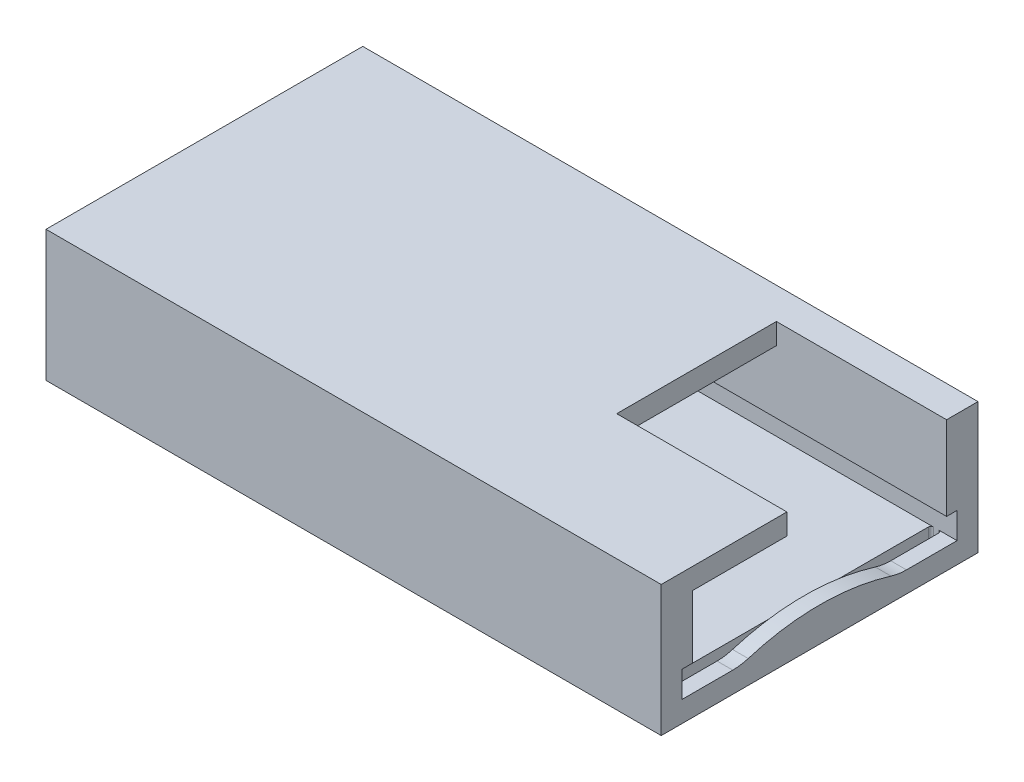
ISO-10303-21;
HEADER;
FILE_DESCRIPTION(('STEP AP214'),'2;1');
FILE_NAME('part.step','',(''),(''),'','','');
FILE_SCHEMA(('AUTOMOTIVE_DESIGN { 1 0 10303 214 1 1 1 1 }'));
ENDSEC;
DATA;
#1=APPLICATION_CONTEXT('core data for automotive mechanical design processes');
#2=APPLICATION_PROTOCOL_DEFINITION('international standard','automotive_design',2000,#1);
#3=PRODUCT_CONTEXT('',#1,'mechanical');
#4=PRODUCT('Part','Part','',(#3));
#5=PRODUCT_RELATED_PRODUCT_CATEGORY('part','',(#4));
#6=PRODUCT_DEFINITION_FORMATION('','',#4);
#7=PRODUCT_DEFINITION_CONTEXT('part definition',#1,'design');
#8=PRODUCT_DEFINITION('design','',#6,#7);
#9=PRODUCT_DEFINITION_SHAPE('','',#8);
#10=(LENGTH_UNIT() NAMED_UNIT(*) SI_UNIT(.MILLI.,.METRE.));
#11=(NAMED_UNIT(*) PLANE_ANGLE_UNIT() SI_UNIT($,.RADIAN.));
#12=(NAMED_UNIT(*) SI_UNIT($,.STERADIAN.) SOLID_ANGLE_UNIT());
#13=UNCERTAINTY_MEASURE_WITH_UNIT(LENGTH_MEASURE(1.E-05),#10,'distance_accuracy_value','');
#14=(GEOMETRIC_REPRESENTATION_CONTEXT(3) GLOBAL_UNCERTAINTY_ASSIGNED_CONTEXT((#13)) GLOBAL_UNIT_ASSIGNED_CONTEXT((#10,
#11,#12)) REPRESENTATION_CONTEXT('',''));
#15=CARTESIAN_POINT('',(0.,0.,0.));
#16=DIRECTION('',(0.,0.,1.));
#17=DIRECTION('',(1.,0.,0.));
#18=AXIS2_PLACEMENT_3D('',#15,#16,#17);
#19=CARTESIAN_POINT('',(22.5,10.,12.1));
#20=DIRECTION('',(-1.,0.,0.));
#21=DIRECTION('',(0.,0.,1.));
#22=AXIS2_PLACEMENT_3D('',#19,#20,#21);
#23=PLANE('',#22);
#24=DIRECTION('',(0.,0.,-1.));
#25=VECTOR('',#24,1.);
#26=CARTESIAN_POINT('',(22.5,1.6,-10.5));
#27=LINE('',#26,#25);
#28=CARTESIAN_POINT('',(22.5,1.6,10.3));
#29=VERTEX_POINT('',#28);
#30=CARTESIAN_POINT('',(22.5,1.6,-10.3));
#31=VERTEX_POINT('',#30);
#32=EDGE_CURVE('E336',#29,#31,#27,.T.);
#33=ORIENTED_EDGE('',*,*,#32,.F.);
#34=DIRECTION('',(0.,-1.,0.));
#35=VECTOR('',#34,1.);
#36=CARTESIAN_POINT('',(22.5,0.,10.3));
#37=LINE('',#36,#35);
#38=CARTESIAN_POINT('',(22.5,0.,10.3));
#39=VERTEX_POINT('',#38);
#40=EDGE_CURVE('E448',#29,#39,#37,.T.);
#41=ORIENTED_EDGE('',*,*,#40,.T.);
#42=DIRECTION('',(0.,0.,-1.));
#43=VECTOR('',#42,1.);
#44=CARTESIAN_POINT('',(22.5,0.,12.1));
#45=LINE('',#44,#43);
#46=CARTESIAN_POINT('',(22.5,0.,-10.3));
#47=VERTEX_POINT('',#46);
#48=EDGE_CURVE('E401',#39,#47,#45,.T.);
#49=ORIENTED_EDGE('',*,*,#48,.T.);
#50=DIRECTION('',(0.,-1.,0.));
#51=VECTOR('',#50,1.);
#52=CARTESIAN_POINT('',(22.5,1.6,-10.3));
#53=LINE('',#52,#51);
#54=EDGE_CURVE('E446',#47,#31,#53,.F.);
#55=ORIENTED_EDGE('',*,*,#54,.T.);
#56=EDGE_LOOP('',(#33,#41,#49,#55));
#57=FACE_BOUND('',#56,.T.);
#58=ADVANCED_FACE('F37',(#57),#23,.F.);
#59=CARTESIAN_POINT('',(-22.5,10.,12.1));
#60=DIRECTION('',(1.,0.,0.));
#61=DIRECTION('',(0.,0.,-1.));
#62=AXIS2_PLACEMENT_3D('',#59,#60,#61);
#63=PLANE('',#62);
#64=DIRECTION('',(0.,0.,1.));
#65=VECTOR('',#64,1.);
#66=CARTESIAN_POINT('',(-22.5,8.4,2.5));
#67=LINE('',#66,#65);
#68=CARTESIAN_POINT('',(-22.5,8.4,-7.));
#69=VERTEX_POINT('',#68);
#70=CARTESIAN_POINT('',(-22.5,8.4,2.5));
#71=VERTEX_POINT('',#70);
#72=EDGE_CURVE('E330',#69,#71,#67,.T.);
#73=ORIENTED_EDGE('',*,*,#72,.T.);
#74=DIRECTION('',(0.,-1.,0.));
#75=VECTOR('',#74,1.);
#76=CARTESIAN_POINT('',(-22.5,3.6,2.5));
#77=LINE('',#76,#75);
#78=CARTESIAN_POINT('',(-22.5,3.6,2.5));
#79=VERTEX_POINT('',#78);
#80=EDGE_CURVE('E318',#71,#79,#77,.T.);
#81=ORIENTED_EDGE('',*,*,#80,.T.);
#82=DIRECTION('',(0.,0.,-1.));
#83=VECTOR('',#82,1.);
#84=CARTESIAN_POINT('',(-22.5,3.6,2.5));
#85=LINE('',#84,#83);
#86=CARTESIAN_POINT('',(-22.5,3.6,-7.));
#87=VERTEX_POINT('',#86);
#88=EDGE_CURVE('E324',#79,#87,#85,.T.);
#89=ORIENTED_EDGE('',*,*,#88,.T.);
#90=DIRECTION('',(0.,1.,0.));
#91=VECTOR('',#90,1.);
#92=CARTESIAN_POINT('',(-22.5,3.6,-7.));
#93=LINE('',#92,#91);
#94=EDGE_CURVE('E327',#87,#69,#93,.T.);
#95=ORIENTED_EDGE('',*,*,#94,.T.);
#96=EDGE_LOOP('',(#73,#81,#89,#95));
#97=FACE_BOUND('',#96,.T.);
#98=DIRECTION('',(0.,0.,1.));
#99=VECTOR('',#98,1.);
#100=CARTESIAN_POINT('',(-22.5,0.,12.1));
#101=LINE('',#100,#99);
#102=CARTESIAN_POINT('',(-22.5,0.,-12.1));
#103=VERTEX_POINT('',#102);
#104=CARTESIAN_POINT('',(-22.5,0.,12.1));
#105=VERTEX_POINT('',#104);
#106=EDGE_CURVE('E374',#103,#105,#101,.T.);
#107=ORIENTED_EDGE('',*,*,#106,.T.);
#108=DIRECTION('',(0.,-1.,0.));
#109=VECTOR('',#108,1.);
#110=CARTESIAN_POINT('',(-22.5,10.,12.1));
#111=LINE('',#110,#109);
#112=CARTESIAN_POINT('',(-22.5,10.,12.1));
#113=VERTEX_POINT('',#112);
#114=EDGE_CURVE('E407',#113,#105,#111,.T.);
#115=ORIENTED_EDGE('',*,*,#114,.F.);
#116=DIRECTION('',(0.,0.,1.));
#117=VECTOR('',#116,1.);
#118=CARTESIAN_POINT('',(-22.5,10.,12.1));
#119=LINE('',#118,#117);
#120=CARTESIAN_POINT('',(-22.5,10.,-12.1));
#121=VERTEX_POINT('',#120);
#122=EDGE_CURVE('E388',#121,#113,#119,.T.);
#123=ORIENTED_EDGE('',*,*,#122,.F.);
#124=DIRECTION('',(0.,-1.,0.));
#125=VECTOR('',#124,1.);
#126=CARTESIAN_POINT('',(-22.5,10.,-12.1));
#127=LINE('',#126,#125);
#128=EDGE_CURVE('E396',#121,#103,#127,.T.);
#129=ORIENTED_EDGE('',*,*,#128,.T.);
#130=EDGE_LOOP('',(#107,#115,#123,#129));
#131=FACE_BOUND('',#130,.T.);
#132=ADVANCED_FACE('F584',(#97,#131),#63,.F.);
#133=CARTESIAN_POINT('',(22.5,10.,12.1));
#134=DIRECTION('',(0.,0.,-1.));
#135=DIRECTION('',(-1.,0.,0.));
#136=AXIS2_PLACEMENT_3D('',#133,#134,#135);
#137=PLANE('',#136);
#138=DIRECTION('',(1.,0.,0.));
#139=VECTOR('',#138,1.);
#140=CARTESIAN_POINT('',(22.5,0.,12.1));
#141=LINE('',#140,#139);
#142=CARTESIAN_POINT('',(24.5,0.,12.1));
#143=VERTEX_POINT('',#142);
#144=EDGE_CURVE('E399',#105,#143,#141,.T.);
#145=ORIENTED_EDGE('',*,*,#144,.T.);
#146=DIRECTION('',(0.,-1.,0.));
#147=VECTOR('',#146,1.);
#148=CARTESIAN_POINT('',(24.5,0.,12.1));
#149=LINE('',#148,#147);
#150=CARTESIAN_POINT('',(24.5,10.,12.1));
#151=VERTEX_POINT('',#150);
#152=EDGE_CURVE('E297',#151,#143,#149,.T.);
#153=ORIENTED_EDGE('',*,*,#152,.F.);
#154=DIRECTION('',(1.,0.,0.));
#155=VECTOR('',#154,1.);
#156=CARTESIAN_POINT('',(22.5,10.,12.1));
#157=LINE('',#156,#155);
#158=EDGE_CURVE('E391',#113,#151,#157,.T.);
#159=ORIENTED_EDGE('',*,*,#158,.F.);
#160=ORIENTED_EDGE('',*,*,#114,.T.);
#161=EDGE_LOOP('',(#145,#153,#159,#160));
#162=FACE_BOUND('',#161,.T.);
#163=ADVANCED_FACE('F556',(#162),#137,.F.);
#164=CARTESIAN_POINT('',(22.5,10.,-12.1));
#165=DIRECTION('',(0.,0.,1.));
#166=DIRECTION('',(1.,0.,0.));
#167=AXIS2_PLACEMENT_3D('',#164,#165,#166);
#168=PLANE('',#167);
#169=DIRECTION('',(-1.,0.,0.));
#170=VECTOR('',#169,1.);
#171=CARTESIAN_POINT('',(22.5,0.,-12.1));
#172=LINE('',#171,#170);
#173=CARTESIAN_POINT('',(24.5,0.,-12.1));
#174=VERTEX_POINT('',#173);
#175=EDGE_CURVE('E392',#174,#103,#172,.T.);
#176=ORIENTED_EDGE('',*,*,#175,.T.);
#177=ORIENTED_EDGE('',*,*,#128,.F.);
#178=DIRECTION('',(-1.,0.,0.));
#179=VECTOR('',#178,1.);
#180=CARTESIAN_POINT('',(22.5,10.,-12.1));
#181=LINE('',#180,#179);
#182=CARTESIAN_POINT('',(24.5,10.,-12.1));
#183=VERTEX_POINT('',#182);
#184=EDGE_CURVE('E394',#183,#121,#181,.T.);
#185=ORIENTED_EDGE('',*,*,#184,.F.);
#186=DIRECTION('',(0.,1.,0.));
#187=VECTOR('',#186,1.);
#188=CARTESIAN_POINT('',(24.5,0.,-12.1));
#189=LINE('',#188,#187);
#190=EDGE_CURVE('E263',#174,#183,#189,.T.);
#191=ORIENTED_EDGE('',*,*,#190,.F.);
#192=EDGE_LOOP('',(#176,#177,#185,#191));
#193=FACE_BOUND('',#192,.T.);
#194=ADVANCED_FACE('F608',(#193),#168,.F.);
#195=CARTESIAN_POINT('',(0.,10.,0.));
#196=DIRECTION('',(0.,1.,0.));
#197=DIRECTION('',(0.,0.,1.));
#198=AXIS2_PLACEMENT_3D('',#195,#196,#197);
#199=PLANE('',#198);
#200=DIRECTION('',(1.,0.,0.));
#201=VECTOR('',#200,1.);
#202=CARTESIAN_POINT('',(11.5,10.,2.5));
#203=LINE('',#202,#201);
#204=CARTESIAN_POINT('',(11.5,10.,2.5));
#205=VERTEX_POINT('',#204);
#206=CARTESIAN_POINT('',(24.5,10.,2.5));
#207=VERTEX_POINT('',#206);
#208=EDGE_CURVE('E319',#205,#207,#203,.T.);
#209=ORIENTED_EDGE('',*,*,#208,.F.);
#210=DIRECTION('',(0.,0.,1.));
#211=VECTOR('',#210,1.);
#212=CARTESIAN_POINT('',(11.5,10.,-9.7));
#213=LINE('',#212,#211);
#214=CARTESIAN_POINT('',(11.5,10.,-9.7));
#215=VERTEX_POINT('',#214);
#216=EDGE_CURVE('E310',#215,#205,#213,.T.);
#217=ORIENTED_EDGE('',*,*,#216,.F.);
#218=DIRECTION('',(1.,0.,0.));
#219=VECTOR('',#218,1.);
#220=CARTESIAN_POINT('',(11.5,10.,-9.7));
#221=LINE('',#220,#219);
#222=CARTESIAN_POINT('',(24.5,10.,-9.7));
#223=VERTEX_POINT('',#222);
#224=EDGE_CURVE('E315',#215,#223,#221,.T.);
#225=ORIENTED_EDGE('',*,*,#224,.T.);
#226=DIRECTION('',(0.,0.,1.));
#227=VECTOR('',#226,1.);
#228=CARTESIAN_POINT('',(24.5,10.,0.));
#229=LINE('',#228,#227);
#230=EDGE_CURVE('E266',#183,#223,#229,.T.);
#231=ORIENTED_EDGE('',*,*,#230,.F.);
#232=ORIENTED_EDGE('',*,*,#184,.T.);
#233=ORIENTED_EDGE('',*,*,#122,.T.);
#234=ORIENTED_EDGE('',*,*,#158,.T.);
#235=DIRECTION('',(0.,0.,1.));
#236=VECTOR('',#235,1.);
#237=CARTESIAN_POINT('',(24.5,10.,0.));
#238=LINE('',#237,#236);
#239=EDGE_CURVE('E294',#207,#151,#238,.T.);
#240=ORIENTED_EDGE('',*,*,#239,.F.);
#241=EDGE_LOOP('',(#209,#217,#225,#231,#232,#233,#234,#240));
#242=FACE_BOUND('',#241,.T.);
#243=ADVANCED_FACE('F552',(#242),#199,.T.);
#244=CARTESIAN_POINT('',(0.,0.,0.));
#245=DIRECTION('',(0.,1.,0.));
#246=DIRECTION('',(0.,0.,1.));
#247=AXIS2_PLACEMENT_3D('',#244,#245,#246);
#248=PLANE('',#247);
#249=DIRECTION('',(-1.,0.,0.));
#250=VECTOR('',#249,1.);
#251=CARTESIAN_POINT('',(24.5,0.,10.5));
#252=LINE('',#251,#250);
#253=CARTESIAN_POINT('',(23.1,0.,10.5));
#254=VERTEX_POINT('',#253);
#255=CARTESIAN_POINT('',(22.7,0.,10.5));
#256=VERTEX_POINT('',#255);
#257=EDGE_CURVE('E302',#254,#256,#252,.T.);
#258=ORIENTED_EDGE('',*,*,#257,.F.);
#259=CARTESIAN_POINT('',(23.1,0.,10.3));
#260=DIRECTION('',(0.,1.,0.));
#261=DIRECTION('',(0.,0.,1.));
#262=AXIS2_PLACEMENT_3D('',#259,#260,#261);
#263=CIRCLE('',#262,0.2);
#264=CARTESIAN_POINT('',(23.3,0.,10.3));
#265=VERTEX_POINT('',#264);
#266=EDGE_CURVE('E454',#254,#265,#263,.T.);
#267=ORIENTED_EDGE('',*,*,#266,.T.);
#268=DIRECTION('',(0.,0.,-1.));
#269=VECTOR('',#268,1.);
#270=CARTESIAN_POINT('',(23.3,0.,10.5));
#271=LINE('',#270,#269);
#272=CARTESIAN_POINT('',(23.3,0.,-10.3));
#273=VERTEX_POINT('',#272);
#274=EDGE_CURVE('E494',#265,#273,#271,.T.);
#275=ORIENTED_EDGE('',*,*,#274,.T.);
#276=CARTESIAN_POINT('',(23.1,0.,-10.3));
#277=DIRECTION('',(0.,1.,0.));
#278=DIRECTION('',(0.,0.,1.));
#279=AXIS2_PLACEMENT_3D('',#276,#277,#278);
#280=CIRCLE('',#279,0.2);
#281=CARTESIAN_POINT('',(23.1,0.,-10.5));
#282=VERTEX_POINT('',#281);
#283=EDGE_CURVE('E465',#273,#282,#280,.T.);
#284=ORIENTED_EDGE('',*,*,#283,.T.);
#285=DIRECTION('',(-1.,0.,0.));
#286=VECTOR('',#285,1.);
#287=CARTESIAN_POINT('',(24.5,0.,-10.5));
#288=LINE('',#287,#286);
#289=CARTESIAN_POINT('',(22.7,0.,-10.5));
#290=VERTEX_POINT('',#289);
#291=EDGE_CURVE('E276',#282,#290,#288,.T.);
#292=ORIENTED_EDGE('',*,*,#291,.T.);
#293=CARTESIAN_POINT('',(22.7,0.,-10.3));
#294=DIRECTION('',(0.,1.,0.));
#295=DIRECTION('',(0.,0.,1.));
#296=AXIS2_PLACEMENT_3D('',#293,#294,#295);
#297=CIRCLE('',#296,0.2);
#298=EDGE_CURVE('E45',#290,#47,#297,.T.);
#299=ORIENTED_EDGE('',*,*,#298,.T.);
#300=ORIENTED_EDGE('',*,*,#48,.F.);
#301=CARTESIAN_POINT('',(22.7,0.,10.3));
#302=DIRECTION('',(0.,1.,0.));
#303=DIRECTION('',(0.,0.,1.));
#304=AXIS2_PLACEMENT_3D('',#301,#302,#303);
#305=CIRCLE('',#304,0.2);
#306=EDGE_CURVE('E459',#39,#256,#305,.T.);
#307=ORIENTED_EDGE('',*,*,#306,.T.);
#308=EDGE_LOOP('',(#258,#267,#275,#284,#292,#299,#300,#307));
#309=FACE_BOUND('',#308,.T.);
#310=ORIENTED_EDGE('',*,*,#106,.F.);
#311=ORIENTED_EDGE('',*,*,#175,.F.);
#312=DIRECTION('',(0.,0.,-1.));
#313=VECTOR('',#312,1.);
#314=CARTESIAN_POINT('',(24.5,0.,0.));
#315=LINE('',#314,#313);
#316=EDGE_CURVE('E300',#143,#174,#315,.T.);
#317=ORIENTED_EDGE('',*,*,#316,.F.);
#318=ORIENTED_EDGE('',*,*,#144,.F.);
#319=EDGE_LOOP('',(#310,#311,#317,#318));
#320=FACE_BOUND('',#319,.T.);
#321=ADVANCED_FACE('F469',(#309,#320),#248,.F.);
#322=CARTESIAN_POINT('',(-20.5,3.6,9.7));
#323=DIRECTION('',(0.,1.,0.));
#324=DIRECTION('',(0.,0.,1.));
#325=AXIS2_PLACEMENT_3D('',#322,#323,#324);
#326=PLANE('',#325);
#327=DIRECTION('',(1.,0.,0.));
#328=VECTOR('',#327,1.);
#329=CARTESIAN_POINT('',(-20.5,3.6,9.7));
#330=LINE('',#329,#328);
#331=CARTESIAN_POINT('',(-20.5,3.6,9.7));
#332=VERTEX_POINT('',#331);
#333=CARTESIAN_POINT('',(24.5,3.6,9.7));
#334=VERTEX_POINT('',#333);
#335=EDGE_CURVE('E372',#332,#334,#330,.T.);
#336=ORIENTED_EDGE('',*,*,#335,.T.);
#337=DIRECTION('',(0.,0.,-1.));
#338=VECTOR('',#337,1.);
#339=CARTESIAN_POINT('',(24.5,3.6,0.));
#340=LINE('',#339,#338);
#341=CARTESIAN_POINT('',(24.5,3.6,10.5));
#342=VERTEX_POINT('',#341);
#343=EDGE_CURVE('E282',#342,#334,#340,.T.);
#344=ORIENTED_EDGE('',*,*,#343,.F.);
#345=DIRECTION('',(1.,0.,0.));
#346=VECTOR('',#345,1.);
#347=CARTESIAN_POINT('',(-20.5,3.6,10.5));
#348=LINE('',#347,#346);
#349=CARTESIAN_POINT('',(-20.5,3.6,10.5));
#350=VERTEX_POINT('',#349);
#351=EDGE_CURVE('E369',#350,#342,#348,.T.);
#352=ORIENTED_EDGE('',*,*,#351,.F.);
#353=DIRECTION('',(0.,0.,1.));
#354=VECTOR('',#353,1.);
#355=CARTESIAN_POINT('',(-20.5,3.6,9.7));
#356=LINE('',#355,#354);
#357=EDGE_CURVE('E344',#332,#350,#356,.T.);
#358=ORIENTED_EDGE('',*,*,#357,.F.);
#359=EDGE_LOOP('',(#336,#344,#352,#358));
#360=FACE_BOUND('',#359,.T.);
#361=ADVANCED_FACE('F533',(#360),#326,.F.);
#362=CARTESIAN_POINT('',(-20.5,8.4,9.7));
#363=DIRECTION('',(0.,0.,1.));
#364=DIRECTION('',(0.,-1.,0.));
#365=AXIS2_PLACEMENT_3D('',#362,#363,#364);
#366=PLANE('',#365);
#367=DIRECTION('',(1.,0.,0.));
#368=VECTOR('',#367,1.);
#369=CARTESIAN_POINT('',(-20.5,8.4,9.7));
#370=LINE('',#369,#368);
#371=CARTESIAN_POINT('',(-20.5,8.4,9.7));
#372=VERTEX_POINT('',#371);
#373=CARTESIAN_POINT('',(24.5,8.4,9.7));
#374=VERTEX_POINT('',#373);
#375=EDGE_CURVE('E375',#372,#374,#370,.T.);
#376=ORIENTED_EDGE('',*,*,#375,.T.);
#377=DIRECTION('',(0.,1.,0.));
#378=VECTOR('',#377,1.);
#379=CARTESIAN_POINT('',(24.5,0.,9.7));
#380=LINE('',#379,#378);
#381=EDGE_CURVE('E285',#334,#374,#380,.T.);
#382=ORIENTED_EDGE('',*,*,#381,.F.);
#383=ORIENTED_EDGE('',*,*,#335,.F.);
#384=DIRECTION('',(0.,-1.,0.));
#385=VECTOR('',#384,1.);
#386=CARTESIAN_POINT('',(-20.5,8.4,9.7));
#387=LINE('',#386,#385);
#388=EDGE_CURVE('E366',#372,#332,#387,.T.);
#389=ORIENTED_EDGE('',*,*,#388,.F.);
#390=EDGE_LOOP('',(#376,#382,#383,#389));
#391=FACE_BOUND('',#390,.T.);
#392=ADVANCED_FACE('F537',(#391),#366,.F.);
#393=CARTESIAN_POINT('',(-20.5,8.4,-9.7));
#394=DIRECTION('',(0.,1.,0.));
#395=DIRECTION('',(0.,0.,1.));
#396=AXIS2_PLACEMENT_3D('',#393,#394,#395);
#397=PLANE('',#396);
#398=DIRECTION('',(0.,0.,-1.));
#399=VECTOR('',#398,1.);
#400=CARTESIAN_POINT('',(11.5,8.4,2.5));
#401=LINE('',#400,#399);
#402=CARTESIAN_POINT('',(11.5,8.4,2.5));
#403=VERTEX_POINT('',#402);
#404=CARTESIAN_POINT('',(11.5,8.4,-9.7));
#405=VERTEX_POINT('',#404);
#406=EDGE_CURVE('E305',#403,#405,#401,.T.);
#407=ORIENTED_EDGE('',*,*,#406,.F.);
#408=DIRECTION('',(1.,0.,0.));
#409=VECTOR('',#408,1.);
#410=CARTESIAN_POINT('',(11.5,8.4,2.5));
#411=LINE('',#410,#409);
#412=CARTESIAN_POINT('',(24.5,8.4,2.5));
#413=VERTEX_POINT('',#412);
#414=EDGE_CURVE('E316',#403,#413,#411,.T.);
#415=ORIENTED_EDGE('',*,*,#414,.T.);
#416=DIRECTION('',(0.,0.,-1.));
#417=VECTOR('',#416,1.);
#418=CARTESIAN_POINT('',(24.5,8.4,0.));
#419=LINE('',#418,#417);
#420=EDGE_CURVE('E288',#374,#413,#419,.T.);
#421=ORIENTED_EDGE('',*,*,#420,.F.);
#422=ORIENTED_EDGE('',*,*,#375,.F.);
#423=DIRECTION('',(0.,0.,1.));
#424=VECTOR('',#423,1.);
#425=CARTESIAN_POINT('',(-20.5,8.4,-9.7));
#426=LINE('',#425,#424);
#427=CARTESIAN_POINT('',(-20.5,8.4,2.5));
#428=VERTEX_POINT('',#427);
#429=EDGE_CURVE('E362',#428,#372,#426,.T.);
#430=ORIENTED_EDGE('',*,*,#429,.F.);
#431=DIRECTION('',(1.,0.,0.));
#432=VECTOR('',#431,1.);
#433=CARTESIAN_POINT('',(-22.5,8.4,2.5));
#434=LINE('',#433,#432);
#435=EDGE_CURVE('E334',#71,#428,#434,.T.);
#436=ORIENTED_EDGE('',*,*,#435,.F.);
#437=ORIENTED_EDGE('',*,*,#72,.F.);
#438=DIRECTION('',(1.,0.,0.));
#439=VECTOR('',#438,1.);
#440=CARTESIAN_POINT('',(-22.5,8.4,-7.));
#441=LINE('',#440,#439);
#442=CARTESIAN_POINT('',(-20.5,8.4,-7.));
#443=VERTEX_POINT('',#442);
#444=EDGE_CURVE('E337',#69,#443,#441,.T.);
#445=ORIENTED_EDGE('',*,*,#444,.T.);
#446=CARTESIAN_POINT('',(-20.5,8.4,-9.7));
#447=VERTEX_POINT('',#446);
#448=EDGE_CURVE('E363',#447,#443,#426,.T.);
#449=ORIENTED_EDGE('',*,*,#448,.F.);
#450=DIRECTION('',(1.,0.,0.));
#451=VECTOR('',#450,1.);
#452=CARTESIAN_POINT('',(-20.5,8.4,-9.7));
#453=LINE('',#452,#451);
#454=EDGE_CURVE('E377',#447,#405,#453,.T.);
#455=ORIENTED_EDGE('',*,*,#454,.T.);
#456=EDGE_LOOP('',(#407,#415,#421,#422,#430,#436,#437,#445,#449,#455));
#457=FACE_BOUND('',#456,.T.);
#458=ADVANCED_FACE('F543',(#457),#397,.F.);
#459=CARTESIAN_POINT('',(-20.5,3.6,-9.7));
#460=DIRECTION('',(0.,0.,-1.));
#461=DIRECTION('',(-1.,0.,0.));
#462=AXIS2_PLACEMENT_3D('',#459,#460,#461);
#463=PLANE('',#462);
#464=DIRECTION('',(1.,0.,0.));
#465=VECTOR('',#464,1.);
#466=CARTESIAN_POINT('',(-20.5,3.6,-9.7));
#467=LINE('',#466,#465);
#468=CARTESIAN_POINT('',(-20.5,3.6,-9.7));
#469=VERTEX_POINT('',#468);
#470=CARTESIAN_POINT('',(24.5,3.6,-9.7));
#471=VERTEX_POINT('',#470);
#472=EDGE_CURVE('E380',#469,#471,#467,.T.);
#473=ORIENTED_EDGE('',*,*,#472,.T.);
#474=DIRECTION('',(0.,-1.,0.));
#475=VECTOR('',#474,1.);
#476=CARTESIAN_POINT('',(24.5,0.,-9.7));
#477=LINE('',#476,#475);
#478=EDGE_CURVE('E273',#223,#471,#477,.T.);
#479=ORIENTED_EDGE('',*,*,#478,.F.);
#480=ORIENTED_EDGE('',*,*,#224,.F.);
#481=DIRECTION('',(0.,1.,0.));
#482=VECTOR('',#481,1.);
#483=CARTESIAN_POINT('',(11.5,8.4,-9.7));
#484=LINE('',#483,#482);
#485=EDGE_CURVE('E307',#405,#215,#484,.T.);
#486=ORIENTED_EDGE('',*,*,#485,.F.);
#487=ORIENTED_EDGE('',*,*,#454,.F.);
#488=DIRECTION('',(0.,1.,0.));
#489=VECTOR('',#488,1.);
#490=CARTESIAN_POINT('',(-20.5,3.6,-9.7));
#491=LINE('',#490,#489);
#492=EDGE_CURVE('E359',#469,#447,#491,.T.);
#493=ORIENTED_EDGE('',*,*,#492,.F.);
#494=EDGE_LOOP('',(#473,#479,#480,#486,#487,#493));
#495=FACE_BOUND('',#494,.T.);
#496=ADVANCED_FACE('F567',(#495),#463,.F.);
#497=CARTESIAN_POINT('',(-20.5,3.6,-10.5));
#498=DIRECTION('',(0.,1.,0.));
#499=DIRECTION('',(0.,0.,1.));
#500=AXIS2_PLACEMENT_3D('',#497,#498,#499);
#501=PLANE('',#500);
#502=DIRECTION('',(1.,0.,0.));
#503=VECTOR('',#502,1.);
#504=CARTESIAN_POINT('',(-20.5,3.6,-10.5));
#505=LINE('',#504,#503);
#506=CARTESIAN_POINT('',(-20.5,3.6,-10.5));
#507=VERTEX_POINT('',#506);
#508=CARTESIAN_POINT('',(24.5,3.6,-10.5));
#509=VERTEX_POINT('',#508);
#510=EDGE_CURVE('E382',#507,#509,#505,.T.);
#511=ORIENTED_EDGE('',*,*,#510,.T.);
#512=DIRECTION('',(0.,0.,-1.));
#513=VECTOR('',#512,1.);
#514=CARTESIAN_POINT('',(24.5,3.60000000000003,0.));
#515=LINE('',#514,#513);
#516=EDGE_CURVE('E262',#471,#509,#515,.T.);
#517=ORIENTED_EDGE('',*,*,#516,.F.);
#518=ORIENTED_EDGE('',*,*,#472,.F.);
#519=DIRECTION('',(0.,0.,1.));
#520=VECTOR('',#519,1.);
#521=CARTESIAN_POINT('',(-20.5,3.6,-10.5));
#522=LINE('',#521,#520);
#523=EDGE_CURVE('E356',#507,#469,#522,.T.);
#524=ORIENTED_EDGE('',*,*,#523,.F.);
#525=EDGE_LOOP('',(#511,#517,#518,#524));
#526=FACE_BOUND('',#525,.T.);
#527=ADVANCED_FACE('F576',(#526),#501,.F.);
#528=CARTESIAN_POINT('',(-20.5,1.6,-10.5));
#529=DIRECTION('',(0.,0.,-1.));
#530=DIRECTION('',(-1.,0.,0.));
#531=AXIS2_PLACEMENT_3D('',#528,#529,#530);
#532=PLANE('',#531);
#533=ORIENTED_EDGE('',*,*,#291,.F.);
#534=DIRECTION('',(0.,1.,0.));
#535=VECTOR('',#534,1.);
#536=CARTESIAN_POINT('',(23.1,1.6,-10.5));
#537=LINE('',#536,#535);
#538=CARTESIAN_POINT('',(23.1,1.6,-10.5));
#539=VERTEX_POINT('',#538);
#540=EDGE_CURVE('E253',#282,#539,#537,.T.);
#541=ORIENTED_EDGE('',*,*,#540,.T.);
#542=DIRECTION('',(1.,0.,0.));
#543=VECTOR('',#542,1.);
#544=CARTESIAN_POINT('',(23.3,1.6,-10.5));
#545=LINE('',#544,#543);
#546=CARTESIAN_POINT('',(24.5,1.6,-10.5));
#547=VERTEX_POINT('',#546);
#548=EDGE_CURVE('E52',#539,#547,#545,.T.);
#549=ORIENTED_EDGE('',*,*,#548,.T.);
#550=DIRECTION('',(0.,-1.,0.));
#551=VECTOR('',#550,1.);
#552=CARTESIAN_POINT('',(24.5,0.,-10.5));
#553=LINE('',#552,#551);
#554=EDGE_CURVE('E251',#509,#547,#553,.T.);
#555=ORIENTED_EDGE('',*,*,#554,.F.);
#556=ORIENTED_EDGE('',*,*,#510,.F.);
#557=DIRECTION('',(0.,1.,0.));
#558=VECTOR('',#557,1.);
#559=CARTESIAN_POINT('',(-20.5,1.6,-10.5));
#560=LINE('',#559,#558);
#561=CARTESIAN_POINT('',(-20.5,1.6,-10.5));
#562=VERTEX_POINT('',#561);
#563=EDGE_CURVE('E353',#562,#507,#560,.T.);
#564=ORIENTED_EDGE('',*,*,#563,.F.);
#565=DIRECTION('',(1.,0.,0.));
#566=VECTOR('',#565,1.);
#567=CARTESIAN_POINT('',(-20.5,1.6,-10.5));
#568=LINE('',#567,#566);
#569=CARTESIAN_POINT('',(22.7,1.6,-10.5));
#570=VERTEX_POINT('',#569);
#571=EDGE_CURVE('E60',#562,#570,#568,.T.);
#572=ORIENTED_EDGE('',*,*,#571,.T.);
#573=DIRECTION('',(0.,-1.,0.));
#574=VECTOR('',#573,1.);
#575=CARTESIAN_POINT('',(22.7,0.,-10.5));
#576=LINE('',#575,#574);
#577=EDGE_CURVE('E451',#570,#290,#576,.T.);
#578=ORIENTED_EDGE('',*,*,#577,.T.);
#579=EDGE_LOOP('',(#533,#541,#549,#555,#556,#564,#572,#578));
#580=FACE_BOUND('',#579,.T.);
#581=ADVANCED_FACE('F250',(#580),#532,.F.);
#582=CARTESIAN_POINT('',(-20.5,1.6,-10.5));
#583=DIRECTION('',(0.,-1.,0.));
#584=DIRECTION('',(0.,0.,-1.));
#585=AXIS2_PLACEMENT_3D('',#582,#583,#584);
#586=PLANE('',#585);
#587=DIRECTION('',(1.,0.,0.));
#588=VECTOR('',#587,1.);
#589=CARTESIAN_POINT('',(-20.5,1.6,10.5));
#590=LINE('',#589,#588);
#591=CARTESIAN_POINT('',(-20.5,1.6,10.5));
#592=VERTEX_POINT('',#591);
#593=CARTESIAN_POINT('',(22.7,1.6,10.5));
#594=VERTEX_POINT('',#593);
#595=EDGE_CURVE('E385',#592,#594,#590,.T.);
#596=ORIENTED_EDGE('',*,*,#595,.T.);
#597=CARTESIAN_POINT('',(22.7,1.6,10.3));
#598=DIRECTION('',(0.,-1.,0.));
#599=DIRECTION('',(0.,0.,-1.));
#600=AXIS2_PLACEMENT_3D('',#597,#598,#599);
#601=CIRCLE('',#600,0.2);
#602=EDGE_CURVE('E461',#594,#29,#601,.T.);
#603=ORIENTED_EDGE('',*,*,#602,.T.);
#604=ORIENTED_EDGE('',*,*,#32,.T.);
#605=CARTESIAN_POINT('',(22.7,1.6,-10.3));
#606=DIRECTION('',(0.,-1.,0.));
#607=DIRECTION('',(0.,0.,-1.));
#608=AXIS2_PLACEMENT_3D('',#605,#606,#607);
#609=CIRCLE('',#608,0.2);
#610=EDGE_CURVE('E11',#31,#570,#609,.T.);
#611=ORIENTED_EDGE('',*,*,#610,.T.);
#612=ORIENTED_EDGE('',*,*,#571,.F.);
#613=DIRECTION('',(0.,0.,-1.));
#614=VECTOR('',#613,1.);
#615=CARTESIAN_POINT('',(-20.5,1.6,-10.5));
#616=LINE('',#615,#614);
#617=EDGE_CURVE('E350',#592,#562,#616,.T.);
#618=ORIENTED_EDGE('',*,*,#617,.F.);
#619=EDGE_LOOP('',(#596,#603,#604,#611,#612,#618));
#620=FACE_BOUND('',#619,.T.);
#621=ADVANCED_FACE('F479',(#620),#586,.F.);
#622=CARTESIAN_POINT('',(-20.5,1.6,10.5));
#623=DIRECTION('',(0.,0.,1.));
#624=DIRECTION('',(1.,0.,0.));
#625=AXIS2_PLACEMENT_3D('',#622,#623,#624);
#626=PLANE('',#625);
#627=DIRECTION('',(1.,0.,0.));
#628=VECTOR('',#627,1.);
#629=CARTESIAN_POINT('',(23.3,1.6,10.5));
#630=LINE('',#629,#628);
#631=CARTESIAN_POINT('',(23.1,1.6,10.5));
#632=VERTEX_POINT('',#631);
#633=CARTESIAN_POINT('',(24.5,1.6,10.5));
#634=VERTEX_POINT('',#633);
#635=EDGE_CURVE('E254',#632,#634,#630,.T.);
#636=ORIENTED_EDGE('',*,*,#635,.F.);
#637=DIRECTION('',(0.,-1.,0.));
#638=VECTOR('',#637,1.);
#639=CARTESIAN_POINT('',(23.1,0.,10.5));
#640=LINE('',#639,#638);
#641=EDGE_CURVE('E439',#632,#254,#640,.T.);
#642=ORIENTED_EDGE('',*,*,#641,.T.);
#643=ORIENTED_EDGE('',*,*,#257,.T.);
#644=DIRECTION('',(0.,-1.,0.));
#645=VECTOR('',#644,1.);
#646=CARTESIAN_POINT('',(22.7,1.6,10.5));
#647=LINE('',#646,#645);
#648=EDGE_CURVE('E436',#256,#594,#647,.F.);
#649=ORIENTED_EDGE('',*,*,#648,.T.);
#650=ORIENTED_EDGE('',*,*,#595,.F.);
#651=DIRECTION('',(0.,-1.,0.));
#652=VECTOR('',#651,1.);
#653=CARTESIAN_POINT('',(-20.5,1.6,10.5));
#654=LINE('',#653,#652);
#655=EDGE_CURVE('E347',#350,#592,#654,.T.);
#656=ORIENTED_EDGE('',*,*,#655,.F.);
#657=ORIENTED_EDGE('',*,*,#351,.T.);
#658=DIRECTION('',(0.,-1.,0.));
#659=VECTOR('',#658,1.);
#660=CARTESIAN_POINT('',(24.5,0.,10.5));
#661=LINE('',#660,#659);
#662=EDGE_CURVE('E279',#342,#634,#661,.T.);
#663=ORIENTED_EDGE('',*,*,#662,.T.);
#664=EDGE_LOOP('',(#636,#642,#643,#649,#650,#656,#657,#663));
#665=FACE_BOUND('',#664,.T.);
#666=ADVANCED_FACE('F486',(#665),#626,.F.);
#667=CARTESIAN_POINT('',(-20.5,0.,0.));
#668=DIRECTION('',(-1.,0.,0.));
#669=DIRECTION('',(0.,0.,1.));
#670=AXIS2_PLACEMENT_3D('',#667,#668,#669);
#671=PLANE('',#670);
#672=DIRECTION('',(0.,0.,1.));
#673=VECTOR('',#672,1.);
#674=CARTESIAN_POINT('',(-20.5,3.6,0.));
#675=LINE('',#674,#673);
#676=CARTESIAN_POINT('',(-20.5,3.6,-7.));
#677=VERTEX_POINT('',#676);
#678=CARTESIAN_POINT('',(-20.5,3.6,2.5));
#679=VERTEX_POINT('',#678);
#680=EDGE_CURVE('E410',#677,#679,#675,.T.);
#681=ORIENTED_EDGE('',*,*,#680,.T.);
#682=DIRECTION('',(0.,1.,0.));
#683=VECTOR('',#682,1.);
#684=CARTESIAN_POINT('',(-20.5,0.,2.5));
#685=LINE('',#684,#683);
#686=EDGE_CURVE('E416',#679,#428,#685,.T.);
#687=ORIENTED_EDGE('',*,*,#686,.T.);
#688=ORIENTED_EDGE('',*,*,#429,.T.);
#689=ORIENTED_EDGE('',*,*,#388,.T.);
#690=ORIENTED_EDGE('',*,*,#357,.T.);
#691=ORIENTED_EDGE('',*,*,#655,.T.);
#692=ORIENTED_EDGE('',*,*,#617,.T.);
#693=ORIENTED_EDGE('',*,*,#563,.T.);
#694=ORIENTED_EDGE('',*,*,#523,.T.);
#695=ORIENTED_EDGE('',*,*,#492,.T.);
#696=ORIENTED_EDGE('',*,*,#448,.T.);
#697=DIRECTION('',(0.,-1.,0.));
#698=VECTOR('',#697,1.);
#699=CARTESIAN_POINT('',(-20.5,0.,-7.));
#700=LINE('',#699,#698);
#701=EDGE_CURVE('E413',#443,#677,#700,.T.);
#702=ORIENTED_EDGE('',*,*,#701,.T.);
#703=EDGE_LOOP('',(#681,#687,#688,#689,#690,#691,#692,#693,#694,#695,#696,#702));
#704=FACE_BOUND('',#703,.T.);
#705=ADVANCED_FACE('F574',(#704),#671,.F.);
#706=CARTESIAN_POINT('',(-22.5,3.6,2.5));
#707=DIRECTION('',(0.,0.,1.));
#708=DIRECTION('',(0.,-1.,0.));
#709=AXIS2_PLACEMENT_3D('',#706,#707,#708);
#710=PLANE('',#709);
#711=DIRECTION('',(1.,0.,0.));
#712=VECTOR('',#711,1.);
#713=CARTESIAN_POINT('',(-22.5,3.6,2.5));
#714=LINE('',#713,#712);
#715=EDGE_CURVE('E333',#79,#679,#714,.T.);
#716=ORIENTED_EDGE('',*,*,#715,.F.);
#717=ORIENTED_EDGE('',*,*,#80,.F.);
#718=ORIENTED_EDGE('',*,*,#435,.T.);
#719=ORIENTED_EDGE('',*,*,#686,.F.);
#720=EDGE_LOOP('',(#716,#717,#718,#719));
#721=FACE_BOUND('',#720,.T.);
#722=ADVANCED_FACE('F579',(#721),#710,.F.);
#723=CARTESIAN_POINT('',(-22.5,3.6,-7.));
#724=DIRECTION('',(0.,0.,-1.));
#725=DIRECTION('',(0.,1.,0.));
#726=AXIS2_PLACEMENT_3D('',#723,#724,#725);
#727=PLANE('',#726);
#728=ORIENTED_EDGE('',*,*,#444,.F.);
#729=ORIENTED_EDGE('',*,*,#94,.F.);
#730=DIRECTION('',(1.,0.,0.));
#731=VECTOR('',#730,1.);
#732=CARTESIAN_POINT('',(-22.5,3.6,-7.));
#733=LINE('',#732,#731);
#734=EDGE_CURVE('E340',#87,#677,#733,.T.);
#735=ORIENTED_EDGE('',*,*,#734,.T.);
#736=ORIENTED_EDGE('',*,*,#701,.F.);
#737=EDGE_LOOP('',(#728,#729,#735,#736));
#738=FACE_BOUND('',#737,.T.);
#739=ADVANCED_FACE('F588',(#738),#727,.F.);
#740=CARTESIAN_POINT('',(-22.5,3.6,2.5));
#741=DIRECTION('',(0.,-1.,0.));
#742=DIRECTION('',(0.,0.,-1.));
#743=AXIS2_PLACEMENT_3D('',#740,#741,#742);
#744=PLANE('',#743);
#745=ORIENTED_EDGE('',*,*,#734,.F.);
#746=ORIENTED_EDGE('',*,*,#88,.F.);
#747=ORIENTED_EDGE('',*,*,#715,.T.);
#748=ORIENTED_EDGE('',*,*,#680,.F.);
#749=EDGE_LOOP('',(#745,#746,#747,#748));
#750=FACE_BOUND('',#749,.T.);
#751=ADVANCED_FACE('F590',(#750),#744,.F.);
#752=CARTESIAN_POINT('',(11.5,10.,2.5));
#753=DIRECTION('',(0.,0.,1.));
#754=DIRECTION('',(1.,0.,0.));
#755=AXIS2_PLACEMENT_3D('',#752,#753,#754);
#756=PLANE('',#755);
#757=ORIENTED_EDGE('',*,*,#208,.T.);
#758=DIRECTION('',(0.,1.,0.));
#759=VECTOR('',#758,1.);
#760=CARTESIAN_POINT('',(24.5,0.,2.5));
#761=LINE('',#760,#759);
#762=EDGE_CURVE('E291',#413,#207,#761,.T.);
#763=ORIENTED_EDGE('',*,*,#762,.F.);
#764=ORIENTED_EDGE('',*,*,#414,.F.);
#765=DIRECTION('',(0.,-1.,0.));
#766=VECTOR('',#765,1.);
#767=CARTESIAN_POINT('',(11.5,10.,2.5));
#768=LINE('',#767,#766);
#769=EDGE_CURVE('E312',#205,#403,#768,.T.);
#770=ORIENTED_EDGE('',*,*,#769,.F.);
#771=EDGE_LOOP('',(#757,#763,#764,#770));
#772=FACE_BOUND('',#771,.T.);
#773=ADVANCED_FACE('F547',(#772),#756,.F.);
#774=CARTESIAN_POINT('',(11.5,0.,0.));
#775=DIRECTION('',(1.,0.,0.));
#776=DIRECTION('',(0.,0.,-1.));
#777=AXIS2_PLACEMENT_3D('',#774,#775,#776);
#778=PLANE('',#777);
#779=ORIENTED_EDGE('',*,*,#406,.T.);
#780=ORIENTED_EDGE('',*,*,#485,.T.);
#781=ORIENTED_EDGE('',*,*,#216,.T.);
#782=ORIENTED_EDGE('',*,*,#769,.T.);
#783=EDGE_LOOP('',(#779,#780,#781,#782));
#784=FACE_BOUND('',#783,.T.);
#785=ADVANCED_FACE('F569',(#784),#778,.T.);
#786=CARTESIAN_POINT('',(24.5,0.,0.));
#787=DIRECTION('',(1.,0.,0.));
#788=DIRECTION('',(0.,0.,-1.));
#789=AXIS2_PLACEMENT_3D('',#786,#787,#788);
#790=PLANE('',#789);
#791=ORIENTED_EDGE('',*,*,#662,.F.);
#792=ORIENTED_EDGE('',*,*,#343,.T.);
#793=ORIENTED_EDGE('',*,*,#381,.T.);
#794=ORIENTED_EDGE('',*,*,#420,.T.);
#795=ORIENTED_EDGE('',*,*,#762,.T.);
#796=ORIENTED_EDGE('',*,*,#239,.T.);
#797=ORIENTED_EDGE('',*,*,#152,.T.);
#798=ORIENTED_EDGE('',*,*,#316,.T.);
#799=ORIENTED_EDGE('',*,*,#190,.T.);
#800=ORIENTED_EDGE('',*,*,#230,.T.);
#801=ORIENTED_EDGE('',*,*,#478,.T.);
#802=ORIENTED_EDGE('',*,*,#516,.T.);
#803=ORIENTED_EDGE('',*,*,#554,.T.);
#804=DIRECTION('',(0.,0.,1.));
#805=VECTOR('',#804,1.);
#806=CARTESIAN_POINT('',(24.5,1.6,-10.5));
#807=LINE('',#806,#805);
#808=CARTESIAN_POINT('',(24.5,1.6,-6.6332495807108));
#809=VERTEX_POINT('',#808);
#810=EDGE_CURVE('E239',#547,#809,#807,.T.);
#811=ORIENTED_EDGE('',*,*,#810,.T.);
#812=CARTESIAN_POINT('',(24.5,5.6,-6.6332495807108));
#813=DIRECTION('',(1.,0.,0.));
#814=DIRECTION('',(0.,0.,-1.));
#815=AXIS2_PLACEMENT_3D('',#812,#813,#814);
#816=CIRCLE('',#815,4.);
#817=CARTESIAN_POINT('',(24.5,1.77777777777778,-5.45400521080666));
#818=VERTEX_POINT('',#817);
#819=EDGE_CURVE('E427',#809,#818,#816,.F.);
#820=ORIENTED_EDGE('',*,*,#819,.T.);
#821=CARTESIAN_POINT('',(24.5,-15.9,0.));
#822=DIRECTION('',(1.,0.,0.));
#823=DIRECTION('',(0.,0.,-1.));
#824=AXIS2_PLACEMENT_3D('',#821,#822,#823);
#825=CIRCLE('',#824,18.5);
#826=CARTESIAN_POINT('',(24.5,1.77777777777778,5.45400521080665));
#827=VERTEX_POINT('',#826);
#828=EDGE_CURVE('E245',#818,#827,#825,.T.);
#829=ORIENTED_EDGE('',*,*,#828,.T.);
#830=CARTESIAN_POINT('',(24.5,5.6,6.6332495807108));
#831=DIRECTION('',(1.,0.,0.));
#832=DIRECTION('',(0.,0.,-1.));
#833=AXIS2_PLACEMENT_3D('',#830,#831,#832);
#834=CIRCLE('',#833,4.);
#835=CARTESIAN_POINT('',(24.5,1.6,6.6332495807108));
#836=VERTEX_POINT('',#835);
#837=EDGE_CURVE('E432',#827,#836,#834,.F.);
#838=ORIENTED_EDGE('',*,*,#837,.T.);
#839=DIRECTION('',(0.,0.,1.));
#840=VECTOR('',#839,1.);
#841=CARTESIAN_POINT('',(24.5,1.6,6.));
#842=LINE('',#841,#840);
#843=EDGE_CURVE('E503',#836,#634,#842,.T.);
#844=ORIENTED_EDGE('',*,*,#843,.T.);
#845=EDGE_LOOP('',(#791,#792,#793,#794,#795,#796,#797,#798,#799,#800,#801,#802,#803,#811,#820,
#829,#838,#844));
#846=FACE_BOUND('',#845,.T.);
#847=ADVANCED_FACE('F259',(#846),#790,.T.);
#848=CARTESIAN_POINT('',(23.3,1.6,6.));
#849=DIRECTION('',(0.,1.,0.));
#850=DIRECTION('',(0.,0.,1.));
#851=AXIS2_PLACEMENT_3D('',#848,#849,#850);
#852=PLANE('',#851);
#853=ORIENTED_EDGE('',*,*,#843,.F.);
#854=DIRECTION('',(-1.,0.,0.));
#855=VECTOR('',#854,1.);
#856=CARTESIAN_POINT('',(23.3,1.6,6.6332495807108));
#857=LINE('',#856,#855);
#858=CARTESIAN_POINT('',(23.3,1.6,6.6332495807108));
#859=VERTEX_POINT('',#858);
#860=EDGE_CURVE('E425',#836,#859,#857,.T.);
#861=ORIENTED_EDGE('',*,*,#860,.T.);
#862=DIRECTION('',(0.,0.,1.));
#863=VECTOR('',#862,1.);
#864=CARTESIAN_POINT('',(23.3,1.6,6.));
#865=LINE('',#864,#863);
#866=CARTESIAN_POINT('',(23.3,1.6,10.3));
#867=VERTEX_POINT('',#866);
#868=EDGE_CURVE('E255',#859,#867,#865,.T.);
#869=ORIENTED_EDGE('',*,*,#868,.T.);
#870=CARTESIAN_POINT('',(23.1,1.6,10.3));
#871=DIRECTION('',(0.,1.,0.));
#872=DIRECTION('',(0.,0.,1.));
#873=AXIS2_PLACEMENT_3D('',#870,#871,#872);
#874=CIRCLE('',#873,0.2);
#875=EDGE_CURVE('E456',#867,#632,#874,.F.);
#876=ORIENTED_EDGE('',*,*,#875,.T.);
#877=ORIENTED_EDGE('',*,*,#635,.T.);
#878=EDGE_LOOP('',(#853,#861,#869,#876,#877));
#879=FACE_BOUND('',#878,.T.);
#880=ADVANCED_FACE('F528',(#879),#852,.T.);
#881=CARTESIAN_POINT('',(23.3,-15.9,0.));
#882=DIRECTION('',(1.,0.,0.));
#883=DIRECTION('',(0.,0.,-1.));
#884=AXIS2_PLACEMENT_3D('',#881,#882,#883);
#885=CYLINDRICAL_SURFACE('',#884,18.5);
#886=ORIENTED_EDGE('',*,*,#828,.F.);
#887=DIRECTION('',(1.,0.,0.));
#888=VECTOR('',#887,1.);
#889=CARTESIAN_POINT('',(23.3,1.77777777777778,-5.45400521080666));
#890=LINE('',#889,#888);
#891=CARTESIAN_POINT('',(23.3,1.77777777777778,-5.45400521080666));
#892=VERTEX_POINT('',#891);
#893=EDGE_CURVE('E423',#818,#892,#890,.F.);
#894=ORIENTED_EDGE('',*,*,#893,.T.);
#895=CARTESIAN_POINT('',(23.3,-15.9,0.));
#896=DIRECTION('',(1.,0.,0.));
#897=DIRECTION('',(0.,0.,-1.));
#898=AXIS2_PLACEMENT_3D('',#895,#896,#897);
#899=CIRCLE('',#898,18.5);
#900=CARTESIAN_POINT('',(23.3,1.77777777777778,5.45400521080665));
#901=VERTEX_POINT('',#900);
#902=EDGE_CURVE('E505',#892,#901,#899,.T.);
#903=ORIENTED_EDGE('',*,*,#902,.T.);
#904=DIRECTION('',(1.,0.,0.));
#905=VECTOR('',#904,1.);
#906=CARTESIAN_POINT('',(23.3,1.77777777777778,5.45400521080665));
#907=LINE('',#906,#905);
#908=EDGE_CURVE('E420',#901,#827,#907,.T.);
#909=ORIENTED_EDGE('',*,*,#908,.T.);
#910=EDGE_LOOP('',(#886,#894,#903,#909));
#911=FACE_BOUND('',#910,.T.);
#912=ADVANCED_FACE('F517',(#911),#885,.T.);
#913=CARTESIAN_POINT('',(23.3,1.6,-10.5));
#914=DIRECTION('',(0.,1.,0.));
#915=DIRECTION('',(0.,0.,1.));
#916=AXIS2_PLACEMENT_3D('',#913,#914,#915);
#917=PLANE('',#916);
#918=ORIENTED_EDGE('',*,*,#548,.F.);
#919=CARTESIAN_POINT('',(23.1,1.6,-10.3));
#920=DIRECTION('',(0.,1.,0.));
#921=DIRECTION('',(0.,0.,1.));
#922=AXIS2_PLACEMENT_3D('',#919,#920,#921);
#923=CIRCLE('',#922,0.2);
#924=CARTESIAN_POINT('',(23.3,1.6,-10.3));
#925=VERTEX_POINT('',#924);
#926=EDGE_CURVE('E463',#539,#925,#923,.F.);
#927=ORIENTED_EDGE('',*,*,#926,.T.);
#928=DIRECTION('',(0.,0.,1.));
#929=VECTOR('',#928,1.);
#930=CARTESIAN_POINT('',(23.3,1.6,-10.5));
#931=LINE('',#930,#929);
#932=CARTESIAN_POINT('',(23.3,1.6,-6.6332495807108));
#933=VERTEX_POINT('',#932);
#934=EDGE_CURVE('E502',#925,#933,#931,.T.);
#935=ORIENTED_EDGE('',*,*,#934,.T.);
#936=DIRECTION('',(-1.,0.,0.));
#937=VECTOR('',#936,1.);
#938=CARTESIAN_POINT('',(24.5,1.6,-6.6332495807108));
#939=LINE('',#938,#937);
#940=EDGE_CURVE('E242',#933,#809,#939,.F.);
#941=ORIENTED_EDGE('',*,*,#940,.T.);
#942=ORIENTED_EDGE('',*,*,#810,.F.);
#943=EDGE_LOOP('',(#918,#927,#935,#941,#942));
#944=FACE_BOUND('',#943,.T.);
#945=ADVANCED_FACE('F240',(#944),#917,.T.);
#946=CARTESIAN_POINT('',(23.3,-15.9,0.));
#947=DIRECTION('',(1.,0.,0.));
#948=DIRECTION('',(0.,0.,-1.));
#949=AXIS2_PLACEMENT_3D('',#946,#947,#948);
#950=PLANE('',#949);
#951=ORIENTED_EDGE('',*,*,#274,.F.);
#952=DIRECTION('',(0.,-1.,0.));
#953=VECTOR('',#952,1.);
#954=CARTESIAN_POINT('',(23.3,1.6,10.3));
#955=LINE('',#954,#953);
#956=EDGE_CURVE('E444',#265,#867,#955,.F.);
#957=ORIENTED_EDGE('',*,*,#956,.T.);
#958=ORIENTED_EDGE('',*,*,#868,.F.);
#959=CARTESIAN_POINT('',(23.3,5.6,6.6332495807108));
#960=DIRECTION('',(1.,0.,0.));
#961=DIRECTION('',(0.,0.,-1.));
#962=AXIS2_PLACEMENT_3D('',#959,#960,#961);
#963=CIRCLE('',#962,4.);
#964=EDGE_CURVE('E434',#859,#901,#963,.T.);
#965=ORIENTED_EDGE('',*,*,#964,.T.);
#966=ORIENTED_EDGE('',*,*,#902,.F.);
#967=CARTESIAN_POINT('',(23.3,5.6,-6.6332495807108));
#968=DIRECTION('',(1.,0.,0.));
#969=DIRECTION('',(0.,0.,-1.));
#970=AXIS2_PLACEMENT_3D('',#967,#968,#969);
#971=CIRCLE('',#970,4.);
#972=EDGE_CURVE('E429',#892,#933,#971,.T.);
#973=ORIENTED_EDGE('',*,*,#972,.T.);
#974=ORIENTED_EDGE('',*,*,#934,.F.);
#975=DIRECTION('',(0.,1.,0.));
#976=VECTOR('',#975,1.);
#977=CARTESIAN_POINT('',(23.3,0.,-10.3));
#978=LINE('',#977,#976);
#979=EDGE_CURVE('E442',#925,#273,#978,.F.);
#980=ORIENTED_EDGE('',*,*,#979,.T.);
#981=EDGE_LOOP('',(#951,#957,#958,#965,#966,#973,#974,#980));
#982=FACE_BOUND('',#981,.T.);
#983=ADVANCED_FACE('F497',(#982),#950,.F.);
#984=CARTESIAN_POINT('',(23.3,5.6,-6.6332495807108));
#985=DIRECTION('',(1.,0.,0.));
#986=DIRECTION('',(0.,0.,-1.));
#987=AXIS2_PLACEMENT_3D('',#984,#985,#986);
#988=CYLINDRICAL_SURFACE('',#987,4.);
#989=ORIENTED_EDGE('',*,*,#972,.F.);
#990=ORIENTED_EDGE('',*,*,#893,.F.);
#991=ORIENTED_EDGE('',*,*,#819,.F.);
#992=ORIENTED_EDGE('',*,*,#940,.F.);
#993=EDGE_LOOP('',(#989,#990,#991,#992));
#994=FACE_BOUND('',#993,.T.);
#995=ADVANCED_FACE('F522',(#994),#988,.F.);
#996=CARTESIAN_POINT('',(23.3,5.6,6.6332495807108));
#997=DIRECTION('',(1.,0.,0.));
#998=DIRECTION('',(0.,0.,-1.));
#999=AXIS2_PLACEMENT_3D('',#996,#997,#998);
#1000=CYLINDRICAL_SURFACE('',#999,4.);
#1001=ORIENTED_EDGE('',*,*,#964,.F.);
#1002=ORIENTED_EDGE('',*,*,#860,.F.);
#1003=ORIENTED_EDGE('',*,*,#837,.F.);
#1004=ORIENTED_EDGE('',*,*,#908,.F.);
#1005=EDGE_LOOP('',(#1001,#1002,#1003,#1004));
#1006=FACE_BOUND('',#1005,.T.);
#1007=ADVANCED_FACE('F525',(#1006),#1000,.F.);
#1008=CARTESIAN_POINT('',(23.1,1.6,10.3));
#1009=DIRECTION('',(0.,1.,0.));
#1010=DIRECTION('',(0.,0.,1.));
#1011=AXIS2_PLACEMENT_3D('',#1008,#1009,#1010);
#1012=CYLINDRICAL_SURFACE('',#1011,0.2);
#1013=ORIENTED_EDGE('',*,*,#875,.F.);
#1014=ORIENTED_EDGE('',*,*,#956,.F.);
#1015=ORIENTED_EDGE('',*,*,#266,.F.);
#1016=ORIENTED_EDGE('',*,*,#641,.F.);
#1017=EDGE_LOOP('',(#1013,#1014,#1015,#1016));
#1018=FACE_BOUND('',#1017,.T.);
#1019=ADVANCED_FACE('F490',(#1018),#1012,.F.);
#1020=CARTESIAN_POINT('',(22.7,10.,10.3));
#1021=DIRECTION('',(0.,1.,0.));
#1022=DIRECTION('',(0.,0.,1.));
#1023=AXIS2_PLACEMENT_3D('',#1020,#1021,#1022);
#1024=CYLINDRICAL_SURFACE('',#1023,0.2);
#1025=ORIENTED_EDGE('',*,*,#602,.F.);
#1026=ORIENTED_EDGE('',*,*,#648,.F.);
#1027=ORIENTED_EDGE('',*,*,#306,.F.);
#1028=ORIENTED_EDGE('',*,*,#40,.F.);
#1029=EDGE_LOOP('',(#1025,#1026,#1027,#1028));
#1030=FACE_BOUND('',#1029,.T.);
#1031=ADVANCED_FACE('F483',(#1030),#1024,.F.);
#1032=CARTESIAN_POINT('',(23.1,1.6,-10.3));
#1033=DIRECTION('',(0.,-1.,0.));
#1034=DIRECTION('',(0.,0.,-1.));
#1035=AXIS2_PLACEMENT_3D('',#1032,#1033,#1034);
#1036=CYLINDRICAL_SURFACE('',#1035,0.2);
#1037=ORIENTED_EDGE('',*,*,#283,.F.);
#1038=ORIENTED_EDGE('',*,*,#979,.F.);
#1039=ORIENTED_EDGE('',*,*,#926,.F.);
#1040=ORIENTED_EDGE('',*,*,#540,.F.);
#1041=EDGE_LOOP('',(#1037,#1038,#1039,#1040));
#1042=FACE_BOUND('',#1041,.T.);
#1043=ADVANCED_FACE('F619',(#1042),#1036,.F.);
#1044=CARTESIAN_POINT('',(22.7,1.6,-10.3));
#1045=DIRECTION('',(0.,1.,0.));
#1046=DIRECTION('',(0.,0.,1.));
#1047=AXIS2_PLACEMENT_3D('',#1044,#1045,#1046);
#1048=CYLINDRICAL_SURFACE('',#1047,0.2);
#1049=ORIENTED_EDGE('',*,*,#610,.F.);
#1050=ORIENTED_EDGE('',*,*,#54,.F.);
#1051=ORIENTED_EDGE('',*,*,#298,.F.);
#1052=ORIENTED_EDGE('',*,*,#577,.F.);
#1053=EDGE_LOOP('',(#1049,#1050,#1051,#1052));
#1054=FACE_BOUND('',#1053,.T.);
#1055=ADVANCED_FACE('F39',(#1054),#1048,.F.);
#1056=CLOSED_SHELL('',(#58,#132,#163,#194,#243,#321,#361,#392,#458,#496,#527,#581,#621,#666,
#705,#722,#739,#751,#773,#785,#847,#880,#912,#945,#983,#995,#1007,#1019,#1031,#1043,#1055));
#1057=MANIFOLD_SOLID_BREP('B2',#1056);
#1058=ADVANCED_BREP_SHAPE_REPRESENTATION('',(#18,#1057),#14);
#1059=SHAPE_DEFINITION_REPRESENTATION(#9,#1058);
ENDSEC;
END-ISO-10303-21;
